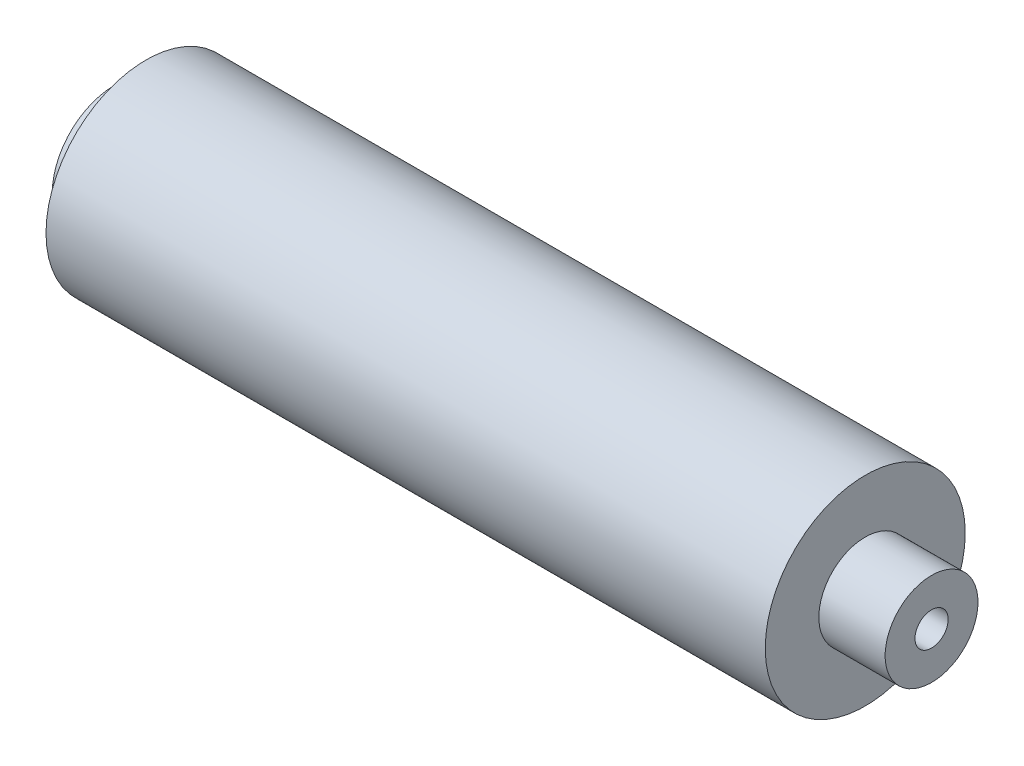
ISO-10303-21;
HEADER;
FILE_DESCRIPTION(('STEP AP214'),'2;1');
FILE_NAME('part.step','',(''),(''),'','','');
FILE_SCHEMA(('AUTOMOTIVE_DESIGN { 1 0 10303 214 1 1 1 1 }'));
ENDSEC;
DATA;
#1=APPLICATION_CONTEXT('core data for automotive mechanical design processes');
#2=APPLICATION_PROTOCOL_DEFINITION('international standard','automotive_design',2000,#1);
#3=PRODUCT_CONTEXT('',#1,'mechanical');
#4=PRODUCT('Part','Part','',(#3));
#5=PRODUCT_RELATED_PRODUCT_CATEGORY('part','',(#4));
#6=PRODUCT_DEFINITION_FORMATION('','',#4);
#7=PRODUCT_DEFINITION_CONTEXT('part definition',#1,'design');
#8=PRODUCT_DEFINITION('design','',#6,#7);
#9=PRODUCT_DEFINITION_SHAPE('','',#8);
#10=(LENGTH_UNIT() NAMED_UNIT(*) SI_UNIT(.MILLI.,.METRE.));
#11=(NAMED_UNIT(*) PLANE_ANGLE_UNIT() SI_UNIT($,.RADIAN.));
#12=(NAMED_UNIT(*) SI_UNIT($,.STERADIAN.) SOLID_ANGLE_UNIT());
#13=UNCERTAINTY_MEASURE_WITH_UNIT(LENGTH_MEASURE(1.E-05),#10,'distance_accuracy_value','');
#14=(GEOMETRIC_REPRESENTATION_CONTEXT(3) GLOBAL_UNCERTAINTY_ASSIGNED_CONTEXT((#13)) GLOBAL_UNIT_ASSIGNED_CONTEXT((#10,
#11,#12)) REPRESENTATION_CONTEXT('',''));
#15=CARTESIAN_POINT('',(0.,0.,0.));
#16=DIRECTION('',(0.,0.,1.));
#17=DIRECTION('',(1.,0.,0.));
#18=AXIS2_PLACEMENT_3D('',#15,#16,#17);
#19=CARTESIAN_POINT('',(118.4446395,0.,0.));
#20=DIRECTION('',(-1.,0.,0.));
#21=DIRECTION('',(0.,0.,1.));
#22=AXIS2_PLACEMENT_3D('',#19,#20,#21);
#23=CYLINDRICAL_SURFACE('',#22,15.07617);
#24=CARTESIAN_POINT('',(0.,0.,0.));
#25=DIRECTION('',(1.,0.,0.));
#26=DIRECTION('',(0.,0.,-1.));
#27=AXIS2_PLACEMENT_3D('',#24,#25,#26);
#28=CIRCLE('',#27,15.07617);
#29=CARTESIAN_POINT('',(0.,0.,15.07617));
#30=VERTEX_POINT('',#29);
#31=EDGE_CURVE('E85',#30,#30,#28,.T.);
#32=CARTESIAN_POINT('',(108.4446395,0.,0.));
#33=DIRECTION('',(1.,0.,0.));
#34=DIRECTION('',(0.,0.,-1.));
#35=AXIS2_PLACEMENT_3D('',#32,#33,#34);
#36=CIRCLE('',#35,15.07617);
#37=CARTESIAN_POINT('',(108.4446395,0.,15.07617));
#38=VERTEX_POINT('',#37);
#39=EDGE_CURVE('E65',#38,#38,#36,.T.);
#40=CARTESIAN_POINT('',(0.,0.,15.07617));
#41=CARTESIAN_POINT('',(1.12963166145834,0.,15.07617));
#42=CARTESIAN_POINT('',(2.25926332291667,0.,15.07617));
#43=CARTESIAN_POINT('',(4.51852664583333,0.,15.07617));
#44=CARTESIAN_POINT('',(5.64815830729167,0.,15.07617));
#45=CARTESIAN_POINT('',(7.90742163020834,0.,15.07617));
#46=CARTESIAN_POINT('',(9.03705329166667,0.,15.07617));
#47=CARTESIAN_POINT('',(11.2963166145833,0.,15.07617));
#48=CARTESIAN_POINT('',(12.4259482760417,0.,15.07617));
#49=CARTESIAN_POINT('',(14.6852115989583,0.,15.07617));
#50=CARTESIAN_POINT('',(15.8148432604167,0.,15.07617));
#51=CARTESIAN_POINT('',(18.0741065833333,0.,15.07617));
#52=CARTESIAN_POINT('',(19.2037382447917,0.,15.07617));
#53=CARTESIAN_POINT('',(21.4630015677083,0.,15.07617));
#54=CARTESIAN_POINT('',(22.5926332291667,0.,15.07617));
#55=CARTESIAN_POINT('',(24.8518965520833,0.,15.07617));
#56=CARTESIAN_POINT('',(25.9815282135417,0.,15.07617));
#57=CARTESIAN_POINT('',(28.2407915364583,0.,15.07617));
#58=CARTESIAN_POINT('',(29.3704231979167,0.,15.07617));
#59=CARTESIAN_POINT('',(31.6296865208333,0.,15.07617));
#60=CARTESIAN_POINT('',(32.7593181822917,0.,15.07617));
#61=CARTESIAN_POINT('',(35.0185815052083,0.,15.07617));
#62=CARTESIAN_POINT('',(36.1482131666667,0.,15.07617));
#63=CARTESIAN_POINT('',(38.4074764895833,0.,15.07617));
#64=CARTESIAN_POINT('',(39.5371081510417,0.,15.07617));
#65=CARTESIAN_POINT('',(41.7963714739583,0.,15.07617));
#66=CARTESIAN_POINT('',(42.9260031354167,0.,15.07617));
#67=CARTESIAN_POINT('',(45.1852664583333,0.,15.07617));
#68=CARTESIAN_POINT('',(46.3148981197917,0.,15.07617));
#69=CARTESIAN_POINT('',(48.5741614427083,0.,15.07617));
#70=CARTESIAN_POINT('',(49.7037931041667,0.,15.07617));
#71=CARTESIAN_POINT('',(51.9630564270833,0.,15.07617));
#72=CARTESIAN_POINT('',(53.0926880885417,0.,15.07617));
#73=CARTESIAN_POINT('',(55.3519514114583,0.,15.07617));
#74=CARTESIAN_POINT('',(56.4815830729167,0.,15.07617));
#75=CARTESIAN_POINT('',(58.7408463958333,0.,15.07617));
#76=CARTESIAN_POINT('',(59.8704780572917,0.,15.07617));
#77=CARTESIAN_POINT('',(62.1297413802083,0.,15.07617));
#78=CARTESIAN_POINT('',(63.2593730416667,0.,15.07617));
#79=CARTESIAN_POINT('',(65.5186363645833,0.,15.07617));
#80=CARTESIAN_POINT('',(66.6482680260417,0.,15.07617));
#81=CARTESIAN_POINT('',(68.9075313489583,0.,15.07617));
#82=CARTESIAN_POINT('',(70.0371630104166,0.,15.07617));
#83=CARTESIAN_POINT('',(72.2964263333333,0.,15.07617));
#84=CARTESIAN_POINT('',(73.4260579947916,0.,15.07617));
#85=CARTESIAN_POINT('',(75.6853213177083,0.,15.07617));
#86=CARTESIAN_POINT('',(76.8149529791666,0.,15.07617));
#87=CARTESIAN_POINT('',(79.0742163020833,0.,15.07617));
#88=CARTESIAN_POINT('',(80.2038479635416,0.,15.07617));
#89=CARTESIAN_POINT('',(82.4631112864583,0.,15.07617));
#90=CARTESIAN_POINT('',(83.5927429479166,0.,15.07617));
#91=CARTESIAN_POINT('',(85.8520062708333,0.,15.07617));
#92=CARTESIAN_POINT('',(86.9816379322916,0.,15.07617));
#93=CARTESIAN_POINT('',(89.2409012552083,0.,15.07617));
#94=CARTESIAN_POINT('',(90.3705329166666,0.,15.07617));
#95=CARTESIAN_POINT('',(92.6297962395833,0.,15.07617));
#96=CARTESIAN_POINT('',(93.7594279010416,0.,15.07617));
#97=CARTESIAN_POINT('',(96.0186912239583,0.,15.07617));
#98=CARTESIAN_POINT('',(97.1483228854166,0.,15.07617));
#99=CARTESIAN_POINT('',(99.4075862083333,0.,15.07617));
#100=CARTESIAN_POINT('',(100.537217869792,0.,15.07617));
#101=CARTESIAN_POINT('',(102.796481192708,0.,15.07617));
#102=CARTESIAN_POINT('',(103.926112854167,0.,15.07617));
#103=CARTESIAN_POINT('',(106.185376177083,0.,15.07617));
#104=CARTESIAN_POINT('',(107.315007838542,0.,15.07617));
#105=CARTESIAN_POINT('',(108.4446395,0.,15.07617));
#106=B_SPLINE_CURVE_WITH_KNOTS('',3,(#40,#41,#42,#43,#44,#45,#46,#47,#48,#49,#50,#51,#52,#53,
#54,#55,#56,#57,#58,#59,#60,#61,#62,#63,#64,#65,#66,#67,#68,#69,#70,#71,#72,#73,#74,#75,#76,#77,
#78,#79,#80,#81,#82,#83,#84,#85,#86,#87,#88,#89,#90,#91,#92,#93,#94,#95,#96,#97,#98,#99,#100,
#101,#102,#103,#104,#105),.UNSPECIFIED.,.F.,.F.,(4,2,2,2,2,2,2,2,2,2,2,2,2,2,2,2,2,2,2,2,2,2,2,
2,2,2,2,2,2,2,2,2,4),(0.,3.388894984375,6.77778996875,10.166684953125,13.5555799375,
16.944474921875,20.33336990625,23.722264890625,27.111159875,30.500054859375,33.88894984375,
37.277844828125,40.6667398125,44.055634796875,47.44452978125,50.833424765625,54.22231975,
57.611214734375,61.00010971875,64.389004703125,67.7778996875,71.166794671875,74.55568965625,
77.944584640625,81.333479625,84.722374609375,88.11126959375,91.500164578125,94.8890595625,
98.277954546875,101.66684953125,105.055744515625,108.4446395),.UNSPECIFIED.);
#107=EDGE_CURVE('BSEAM33',#30,#38,#106,.T.);
#108=ORIENTED_EDGE('',*,*,#31,.T.);
#109=ORIENTED_EDGE('',*,*,#39,.F.);
#110=ORIENTED_EDGE('',*,*,#107,.T.);
#111=ORIENTED_EDGE('',*,*,#107,.F.);
#112=EDGE_LOOP('',(#108,#110,#109,#111));
#113=FACE_BOUND('',#112,.T.);
#114=ADVANCED_FACE('F33',(#113),#23,.T.);
#115=CARTESIAN_POINT('',(0.,0.,0.));
#116=DIRECTION('',(1.,0.,0.));
#117=DIRECTION('',(0.,0.,-1.));
#118=AXIS2_PLACEMENT_3D('',#115,#116,#117);
#119=PLANE('',#118);
#120=CARTESIAN_POINT('',(0.,0.,0.));
#121=DIRECTION('',(1.,0.,0.));
#122=DIRECTION('',(0.,0.,-1.));
#123=AXIS2_PLACEMENT_3D('',#120,#121,#122);
#124=CIRCLE('',#123,9.3853);
#125=CARTESIAN_POINT('',(0.,0.,-9.3853));
#126=VERTEX_POINT('',#125);
#127=EDGE_CURVE('E40',#126,#126,#124,.F.);
#128=ORIENTED_EDGE('',*,*,#127,.F.);
#129=EDGE_LOOP('',(#128));
#130=FACE_BOUND('',#129,.T.);
#131=ORIENTED_EDGE('',*,*,#31,.F.);
#132=EDGE_LOOP('',(#131));
#133=FACE_BOUND('',#132,.T.);
#134=ADVANCED_FACE('F92',(#130,#133),#119,.F.);
#135=CARTESIAN_POINT('',(-4.7498,0.,0.));
#136=DIRECTION('',(-1.,0.,0.));
#137=DIRECTION('',(0.,0.,1.));
#138=AXIS2_PLACEMENT_3D('',#135,#136,#137);
#139=PLANE('',#138);
#140=CARTESIAN_POINT('',(-4.7498,0.,0.));
#141=DIRECTION('',(-1.,0.,0.));
#142=DIRECTION('',(0.,0.,1.));
#143=AXIS2_PLACEMENT_3D('',#140,#141,#142);
#144=CIRCLE('',#143,9.3853);
#145=CARTESIAN_POINT('',(-4.7498,0.,9.3853));
#146=VERTEX_POINT('',#145);
#147=EDGE_CURVE('E80',#146,#146,#144,.T.);
#148=ORIENTED_EDGE('',*,*,#147,.T.);
#149=EDGE_LOOP('',(#148));
#150=FACE_BOUND('',#149,.T.);
#151=CARTESIAN_POINT('',(-4.7498,0.,0.));
#152=DIRECTION('',(-1.,0.,0.));
#153=DIRECTION('',(0.,0.,1.));
#154=AXIS2_PLACEMENT_3D('',#151,#152,#153);
#155=CIRCLE('',#154,4.5847);
#156=CARTESIAN_POINT('',(-4.7498,0.,4.5847));
#157=VERTEX_POINT('',#156);
#158=EDGE_CURVE('E77',#157,#157,#155,.T.);
#159=ORIENTED_EDGE('',*,*,#158,.F.);
#160=EDGE_LOOP('',(#159));
#161=FACE_BOUND('',#160,.T.);
#162=ADVANCED_FACE('F95',(#150,#161),#139,.T.);
#163=CARTESIAN_POINT('',(-4.7498,0.,0.));
#164=DIRECTION('',(1.,0.,0.));
#165=DIRECTION('',(0.,0.,-1.));
#166=AXIS2_PLACEMENT_3D('',#163,#164,#165);
#167=CYLINDRICAL_SURFACE('',#166,9.3853);
#168=ORIENTED_EDGE('',*,*,#147,.F.);
#169=EDGE_LOOP('',(#168));
#170=FACE_BOUND('',#169,.T.);
#171=ORIENTED_EDGE('',*,*,#127,.T.);
#172=EDGE_LOOP('',(#171));
#173=FACE_BOUND('',#172,.T.);
#174=ADVANCED_FACE('F90',(#170,#173),#167,.T.);
#175=CARTESIAN_POINT('',(-4.7498,0.,0.));
#176=DIRECTION('',(1.,0.,0.));
#177=DIRECTION('',(0.,0.,-1.));
#178=AXIS2_PLACEMENT_3D('',#175,#176,#177);
#179=CYLINDRICAL_SURFACE('',#178,4.5847);
#180=ORIENTED_EDGE('',*,*,#158,.T.);
#181=EDGE_LOOP('',(#180));
#182=FACE_BOUND('',#181,.T.);
#183=CARTESIAN_POINT('',(0.,0.,0.));
#184=DIRECTION('',(-1.,0.,0.));
#185=DIRECTION('',(0.,0.,1.));
#186=AXIS2_PLACEMENT_3D('',#183,#184,#185);
#187=CIRCLE('',#186,4.5847);
#188=CARTESIAN_POINT('',(0.,0.,4.5847));
#189=VERTEX_POINT('',#188);
#190=EDGE_CURVE('E71',#189,#189,#187,.T.);
#191=ORIENTED_EDGE('',*,*,#190,.F.);
#192=EDGE_LOOP('',(#191));
#193=FACE_BOUND('',#192,.T.);
#194=ADVANCED_FACE('F143',(#182,#193),#179,.F.);
#195=ORIENTED_EDGE('',*,*,#190,.T.);
#196=EDGE_LOOP('',(#195));
#197=FACE_BOUND('',#196,.T.);
#198=ADVANCED_FACE('F96',(#197),#119,.F.);
#199=CARTESIAN_POINT('',(108.4446395,0.,0.));
#200=DIRECTION('',(1.,0.,0.));
#201=DIRECTION('',(0.,0.,-1.));
#202=AXIS2_PLACEMENT_3D('',#199,#200,#201);
#203=PLANE('',#202);
#204=CARTESIAN_POINT('',(108.4446395,0.,0.));
#205=DIRECTION('',(1.,0.,0.));
#206=DIRECTION('',(0.,0.,-1.));
#207=AXIS2_PLACEMENT_3D('',#204,#205,#206);
#208=CIRCLE('',#207,7.);
#209=CARTESIAN_POINT('',(108.4446395,0.,-7.));
#210=VERTEX_POINT('',#209);
#211=EDGE_CURVE('E104',#210,#210,#208,.T.);
#212=ORIENTED_EDGE('',*,*,#211,.F.);
#213=EDGE_LOOP('',(#212));
#214=FACE_BOUND('',#213,.T.);
#215=ORIENTED_EDGE('',*,*,#39,.T.);
#216=EDGE_LOOP('',(#215));
#217=FACE_BOUND('',#216,.T.);
#218=ADVANCED_FACE('F125',(#214,#217),#203,.T.);
#219=CARTESIAN_POINT('',(108.4446395,0.,0.));
#220=DIRECTION('',(1.,0.,0.));
#221=DIRECTION('',(0.,0.,-1.));
#222=AXIS2_PLACEMENT_3D('',#219,#220,#221);
#223=CYLINDRICAL_SURFACE('',#222,7.);
#224=ORIENTED_EDGE('',*,*,#211,.T.);
#225=EDGE_LOOP('',(#224));
#226=FACE_BOUND('',#225,.T.);
#227=CARTESIAN_POINT('',(118.4446395,0.,0.));
#228=DIRECTION('',(1.,0.,0.));
#229=DIRECTION('',(0.,0.,-1.));
#230=AXIS2_PLACEMENT_3D('',#227,#228,#229);
#231=CIRCLE('',#230,7.);
#232=CARTESIAN_POINT('',(118.4446395,0.,-7.));
#233=VERTEX_POINT('',#232);
#234=EDGE_CURVE('E107',#233,#233,#231,.T.);
#235=ORIENTED_EDGE('',*,*,#234,.F.);
#236=EDGE_LOOP('',(#235));
#237=FACE_BOUND('',#236,.T.);
#238=ADVANCED_FACE('F122',(#226,#237),#223,.T.);
#239=CARTESIAN_POINT('',(92.4446395,0.,0.));
#240=DIRECTION('',(1.,0.,0.));
#241=DIRECTION('',(0.,0.,-1.));
#242=AXIS2_PLACEMENT_3D('',#239,#240,#241);
#243=PLANE('',#242);
#244=CARTESIAN_POINT('',(92.4446395,0.,0.));
#245=DIRECTION('',(1.,0.,0.));
#246=DIRECTION('',(0.,0.,-1.));
#247=AXIS2_PLACEMENT_3D('',#244,#245,#246);
#248=CIRCLE('',#247,2.5);
#249=CARTESIAN_POINT('',(92.4446395,1.75000000727988,1.7853571));
#250=VERTEX_POINT('',#249);
#251=CARTESIAN_POINT('',(92.4446395,1.75000000727988,-1.7853571));
#252=VERTEX_POINT('',#251);
#253=EDGE_CURVE('E73',#250,#252,#248,.T.);
#254=ORIENTED_EDGE('',*,*,#253,.T.);
#255=DIRECTION('',(0.,0.,1.));
#256=VECTOR('',#255,1.);
#257=CARTESIAN_POINT('',(92.4446395,1.75000000727988,1.7853571));
#258=LINE('',#257,#256);
#259=EDGE_CURVE('E69',#252,#250,#258,.T.);
#260=ORIENTED_EDGE('',*,*,#259,.T.);
#261=EDGE_LOOP('',(#254,#260));
#262=FACE_BOUND('',#261,.T.);
#263=ADVANCED_FACE('F124',(#262),#243,.T.);
#264=CARTESIAN_POINT('',(92.4446395,1.75000000727988,1.7853571));
#265=DIRECTION('',(0.,1.,0.));
#266=DIRECTION('',(0.,0.,1.));
#267=AXIS2_PLACEMENT_3D('',#264,#265,#266);
#268=PLANE('',#267);
#269=DIRECTION('',(0.,0.,-1.));
#270=VECTOR('',#269,1.);
#271=CARTESIAN_POINT('',(115.8446395,1.75000000727988,1.7853571));
#272=LINE('',#271,#270);
#273=CARTESIAN_POINT('',(115.8446395,1.75000000727988,1.7853571));
#274=VERTEX_POINT('',#273);
#275=CARTESIAN_POINT('',(115.8446395,1.75000000727988,-1.7853571));
#276=VERTEX_POINT('',#275);
#277=EDGE_CURVE('E11',#274,#276,#272,.T.);
#278=ORIENTED_EDGE('',*,*,#277,.F.);
#279=DIRECTION('',(1.,0.,0.));
#280=VECTOR('',#279,1.);
#281=CARTESIAN_POINT('',(92.4446395,1.75000000727988,1.7853571));
#282=LINE('',#281,#280);
#283=EDGE_CURVE('E52',#250,#274,#282,.T.);
#284=ORIENTED_EDGE('',*,*,#283,.F.);
#285=ORIENTED_EDGE('',*,*,#259,.F.);
#286=DIRECTION('',(1.,0.,0.));
#287=VECTOR('',#286,1.);
#288=CARTESIAN_POINT('',(92.4446395,1.75000000727988,-1.7853571));
#289=LINE('',#288,#287);
#290=EDGE_CURVE('E62',#252,#276,#289,.T.);
#291=ORIENTED_EDGE('',*,*,#290,.T.);
#292=EDGE_LOOP('',(#278,#284,#285,#291));
#293=FACE_BOUND('',#292,.T.);
#294=ADVANCED_FACE('F67',(#293),#268,.F.);
#295=CARTESIAN_POINT('',(115.8446395,0.,0.));
#296=DIRECTION('',(1.,0.,0.));
#297=DIRECTION('',(0.,0.,-1.));
#298=AXIS2_PLACEMENT_3D('',#295,#296,#297);
#299=PLANE('',#298);
#300=ORIENTED_EDGE('',*,*,#277,.T.);
#301=CARTESIAN_POINT('',(115.8446395,0.,0.));
#302=DIRECTION('',(1.,0.,0.));
#303=DIRECTION('',(0.,0.,-1.));
#304=AXIS2_PLACEMENT_3D('',#301,#302,#303);
#305=CIRCLE('',#304,2.5);
#306=EDGE_CURVE('E45',#276,#274,#305,.T.);
#307=ORIENTED_EDGE('',*,*,#306,.T.);
#308=EDGE_LOOP('',(#300,#307));
#309=FACE_BOUND('',#308,.T.);
#310=ADVANCED_FACE('F58',(#309),#299,.T.);
#311=CARTESIAN_POINT('',(92.4446395,0.,0.));
#312=DIRECTION('',(1.,0.,0.));
#313=DIRECTION('',(0.,0.,-1.));
#314=AXIS2_PLACEMENT_3D('',#311,#312,#313);
#315=CYLINDRICAL_SURFACE('',#314,2.5);
#316=CARTESIAN_POINT('',(118.4446395,0.,0.));
#317=DIRECTION('',(1.,0.,0.));
#318=DIRECTION('',(0.,0.,-1.));
#319=AXIS2_PLACEMENT_3D('',#316,#317,#318);
#320=CIRCLE('',#319,2.5);
#321=CARTESIAN_POINT('',(118.4446395,0.,-2.5));
#322=VERTEX_POINT('',#321);
#323=EDGE_CURVE('E64',#322,#322,#320,.T.);
#324=ORIENTED_EDGE('',*,*,#323,.T.);
#325=EDGE_LOOP('',(#324));
#326=FACE_BOUND('',#325,.T.);
#327=ORIENTED_EDGE('',*,*,#306,.F.);
#328=ORIENTED_EDGE('',*,*,#290,.F.);
#329=ORIENTED_EDGE('',*,*,#253,.F.);
#330=ORIENTED_EDGE('',*,*,#283,.T.);
#331=EDGE_LOOP('',(#327,#328,#329,#330));
#332=FACE_BOUND('',#331,.T.);
#333=ADVANCED_FACE('F61',(#326,#332),#315,.F.);
#334=CARTESIAN_POINT('',(118.4446395,0.,0.));
#335=DIRECTION('',(1.,0.,0.));
#336=DIRECTION('',(0.,0.,-1.));
#337=AXIS2_PLACEMENT_3D('',#334,#335,#336);
#338=PLANE('',#337);
#339=ORIENTED_EDGE('',*,*,#323,.F.);
#340=EDGE_LOOP('',(#339));
#341=FACE_BOUND('',#340,.T.);
#342=ORIENTED_EDGE('',*,*,#234,.T.);
#343=EDGE_LOOP('',(#342));
#344=FACE_BOUND('',#343,.T.);
#345=ADVANCED_FACE('F115',(#341,#344),#338,.T.);
#346=CLOSED_SHELL('',(#114,#134,#162,#174,#194,#198,#218,#238,#263,#294,#310,#333,#345));
#347=MANIFOLD_SOLID_BREP('B2',#346);
#348=ADVANCED_BREP_SHAPE_REPRESENTATION('',(#18,#347),#14);
#349=SHAPE_DEFINITION_REPRESENTATION(#9,#348);
ENDSEC;
END-ISO-10303-21;
